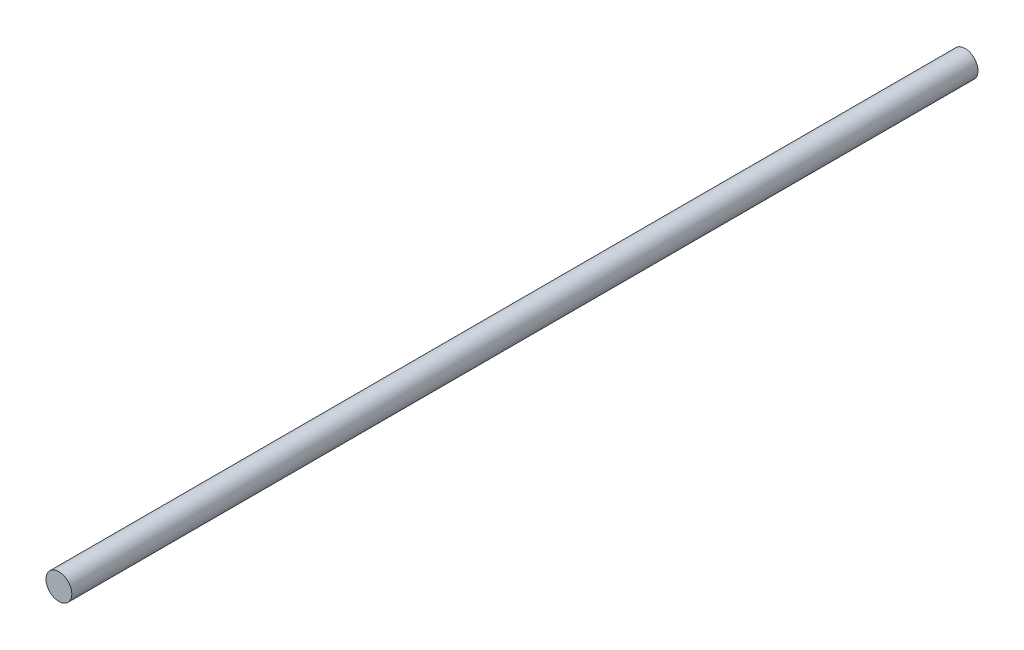
ISO-10303-21;
HEADER;
FILE_DESCRIPTION(('STEP AP214'),'2;1');
FILE_NAME('part.step','',(''),(''),'','','');
FILE_SCHEMA(('AUTOMOTIVE_DESIGN { 1 0 10303 214 1 1 1 1 }'));
ENDSEC;
DATA;
#1=APPLICATION_CONTEXT('core data for automotive mechanical design processes');
#2=APPLICATION_PROTOCOL_DEFINITION('international standard','automotive_design',2000,#1);
#3=PRODUCT_CONTEXT('',#1,'mechanical');
#4=PRODUCT('Part','Part','',(#3));
#5=PRODUCT_RELATED_PRODUCT_CATEGORY('part','',(#4));
#6=PRODUCT_DEFINITION_FORMATION('','',#4);
#7=PRODUCT_DEFINITION_CONTEXT('part definition',#1,'design');
#8=PRODUCT_DEFINITION('design','',#6,#7);
#9=PRODUCT_DEFINITION_SHAPE('','',#8);
#10=(LENGTH_UNIT() NAMED_UNIT(*) SI_UNIT(.MILLI.,.METRE.));
#11=(NAMED_UNIT(*) PLANE_ANGLE_UNIT() SI_UNIT($,.RADIAN.));
#12=(NAMED_UNIT(*) SI_UNIT($,.STERADIAN.) SOLID_ANGLE_UNIT());
#13=UNCERTAINTY_MEASURE_WITH_UNIT(LENGTH_MEASURE(1.E-05),#10,'distance_accuracy_value','');
#14=(GEOMETRIC_REPRESENTATION_CONTEXT(3) GLOBAL_UNCERTAINTY_ASSIGNED_CONTEXT((#13)) GLOBAL_UNIT_ASSIGNED_CONTEXT((#10,
#11,#12)) REPRESENTATION_CONTEXT('',''));
#15=CARTESIAN_POINT('',(0.,0.,0.));
#16=DIRECTION('',(0.,0.,1.));
#17=DIRECTION('',(1.,0.,0.));
#18=AXIS2_PLACEMENT_3D('',#15,#16,#17);
#19=CARTESIAN_POINT('',(0.,0.,254.));
#20=DIRECTION('',(0.,0.,-1.));
#21=DIRECTION('',(-1.,0.,0.));
#22=AXIS2_PLACEMENT_3D('',#19,#20,#21);
#23=CYLINDRICAL_SURFACE('',#22,3.6195);
#24=CARTESIAN_POINT('',(0.,0.,254.));
#25=DIRECTION('',(0.,0.,1.));
#26=DIRECTION('',(1.,0.,0.));
#27=AXIS2_PLACEMENT_3D('',#24,#25,#26);
#28=CIRCLE('',#27,3.6195);
#29=CARTESIAN_POINT('',(3.6195,0.,254.));
#30=VERTEX_POINT('',#29);
#31=EDGE_CURVE('E10',#30,#30,#28,.T.);
#32=ORIENTED_EDGE('',*,*,#31,.F.);
#33=EDGE_LOOP('',(#32));
#34=FACE_BOUND('',#33,.T.);
#35=CARTESIAN_POINT('',(0.,0.,0.));
#36=DIRECTION('',(0.,0.,1.));
#37=DIRECTION('',(1.,0.,0.));
#38=AXIS2_PLACEMENT_3D('',#35,#36,#37);
#39=CIRCLE('',#38,3.6195);
#40=CARTESIAN_POINT('',(3.6195,0.,0.));
#41=VERTEX_POINT('',#40);
#42=EDGE_CURVE('E36',#41,#41,#39,.T.);
#43=ORIENTED_EDGE('',*,*,#42,.T.);
#44=EDGE_LOOP('',(#43));
#45=FACE_BOUND('',#44,.T.);
#46=ADVANCED_FACE('F33',(#34,#45),#23,.T.);
#47=CARTESIAN_POINT('',(0.,0.,254.));
#48=DIRECTION('',(0.,0.,1.));
#49=DIRECTION('',(1.,0.,0.));
#50=AXIS2_PLACEMENT_3D('',#47,#48,#49);
#51=PLANE('',#50);
#52=ORIENTED_EDGE('',*,*,#31,.T.);
#53=EDGE_LOOP('',(#52));
#54=FACE_BOUND('',#53,.T.);
#55=ADVANCED_FACE('F48',(#54),#51,.T.);
#56=CARTESIAN_POINT('',(0.,0.,0.));
#57=DIRECTION('',(0.,0.,1.));
#58=DIRECTION('',(1.,0.,0.));
#59=AXIS2_PLACEMENT_3D('',#56,#57,#58);
#60=PLANE('',#59);
#61=ORIENTED_EDGE('',*,*,#42,.F.);
#62=EDGE_LOOP('',(#61));
#63=FACE_BOUND('',#62,.T.);
#64=ADVANCED_FACE('F46',(#63),#60,.F.);
#65=CLOSED_SHELL('',(#46,#55,#64));
#66=MANIFOLD_SOLID_BREP('B2',#65);
#67=ADVANCED_BREP_SHAPE_REPRESENTATION('',(#18,#66),#14);
#68=SHAPE_DEFINITION_REPRESENTATION(#9,#67);
ENDSEC;
END-ISO-10303-21;
